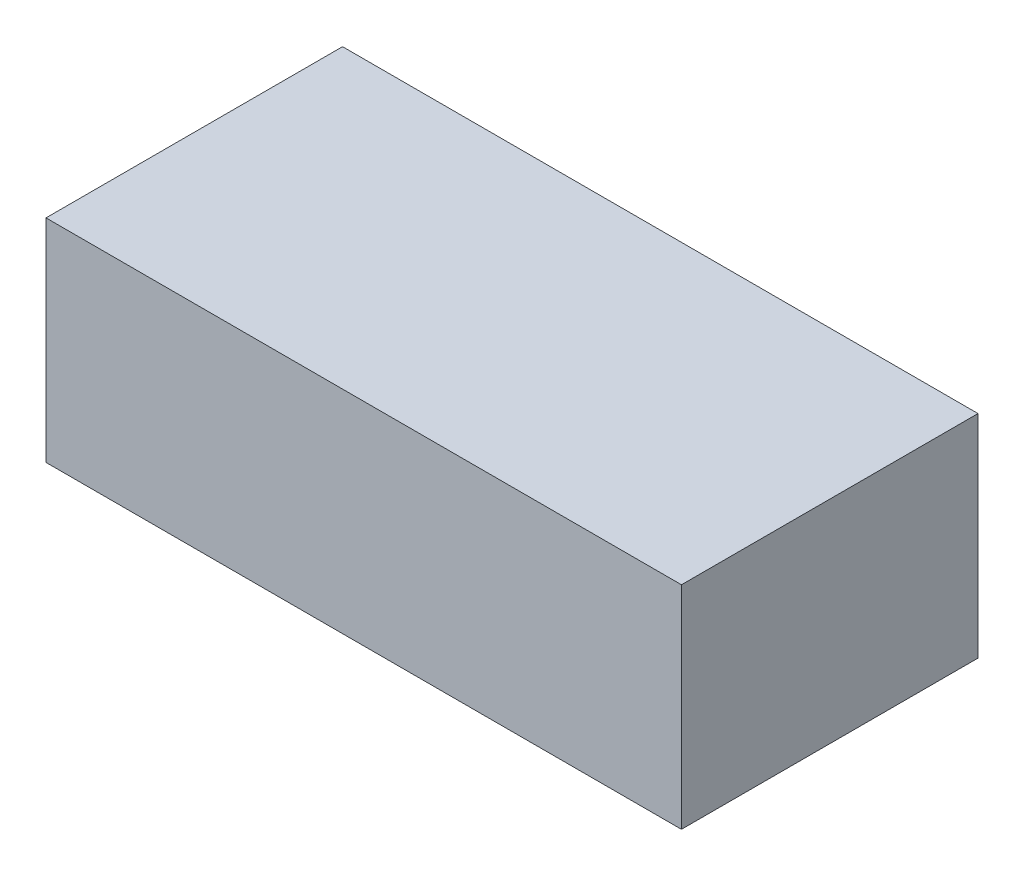
ISO-10303-21;
HEADER;
FILE_DESCRIPTION(('STEP AP214'),'2;1');
FILE_NAME('part.step','',(''),(''),'','','');
FILE_SCHEMA(('AUTOMOTIVE_DESIGN { 1 0 10303 214 1 1 1 1 }'));
ENDSEC;
DATA;
#1=APPLICATION_CONTEXT('core data for automotive mechanical design processes');
#2=APPLICATION_PROTOCOL_DEFINITION('international standard','automotive_design',2000,#1);
#3=PRODUCT_CONTEXT('',#1,'mechanical');
#4=PRODUCT('Part','Part','',(#3));
#5=PRODUCT_RELATED_PRODUCT_CATEGORY('part','',(#4));
#6=PRODUCT_DEFINITION_FORMATION('','',#4);
#7=PRODUCT_DEFINITION_CONTEXT('part definition',#1,'design');
#8=PRODUCT_DEFINITION('design','',#6,#7);
#9=PRODUCT_DEFINITION_SHAPE('','',#8);
#10=(LENGTH_UNIT() NAMED_UNIT(*) SI_UNIT(.MILLI.,.METRE.));
#11=(NAMED_UNIT(*) PLANE_ANGLE_UNIT() SI_UNIT($,.RADIAN.));
#12=(NAMED_UNIT(*) SI_UNIT($,.STERADIAN.) SOLID_ANGLE_UNIT());
#13=UNCERTAINTY_MEASURE_WITH_UNIT(LENGTH_MEASURE(1.E-05),#10,'distance_accuracy_value','');
#14=(GEOMETRIC_REPRESENTATION_CONTEXT(3) GLOBAL_UNCERTAINTY_ASSIGNED_CONTEXT((#13)) GLOBAL_UNIT_ASSIGNED_CONTEXT((#10,
#11,#12)) REPRESENTATION_CONTEXT('',''));
#15=CARTESIAN_POINT('',(0.,0.,0.));
#16=DIRECTION('',(0.,0.,1.));
#17=DIRECTION('',(1.,0.,0.));
#18=AXIS2_PLACEMENT_3D('',#15,#16,#17);
#19=CARTESIAN_POINT('',(0.,0.,35.));
#20=DIRECTION('',(1.,0.,0.));
#21=DIRECTION('',(0.,0.,-1.));
#22=AXIS2_PLACEMENT_3D('',#19,#20,#21);
#23=PLANE('',#22);
#24=DIRECTION('',(0.,-1.,0.));
#25=VECTOR('',#24,1.);
#26=CARTESIAN_POINT('',(0.,0.,0.));
#27=LINE('',#26,#25);
#28=CARTESIAN_POINT('',(0.,25.,0.));
#29=VERTEX_POINT('',#28);
#30=CARTESIAN_POINT('',(0.,0.,0.));
#31=VERTEX_POINT('',#30);
#32=EDGE_CURVE('E102',#29,#31,#27,.T.);
#33=ORIENTED_EDGE('',*,*,#32,.T.);
#34=DIRECTION('',(0.,0.,-1.));
#35=VECTOR('',#34,1.);
#36=CARTESIAN_POINT('',(0.,0.,35.));
#37=LINE('',#36,#35);
#38=CARTESIAN_POINT('',(0.,0.,35.));
#39=VERTEX_POINT('',#38);
#40=EDGE_CURVE('E11',#39,#31,#37,.T.);
#41=ORIENTED_EDGE('',*,*,#40,.F.);
#42=DIRECTION('',(0.,-1.,0.));
#43=VECTOR('',#42,1.);
#44=CARTESIAN_POINT('',(0.,0.,35.));
#45=LINE('',#44,#43);
#46=CARTESIAN_POINT('',(0.,25.,35.));
#47=VERTEX_POINT('',#46);
#48=EDGE_CURVE('E90',#47,#39,#45,.T.);
#49=ORIENTED_EDGE('',*,*,#48,.F.);
#50=DIRECTION('',(0.,0.,-1.));
#51=VECTOR('',#50,1.);
#52=CARTESIAN_POINT('',(0.,25.,35.));
#53=LINE('',#52,#51);
#54=EDGE_CURVE('E98',#47,#29,#53,.T.);
#55=ORIENTED_EDGE('',*,*,#54,.T.);
#56=EDGE_LOOP('',(#33,#41,#49,#55));
#57=FACE_BOUND('',#56,.T.);
#58=ADVANCED_FACE('F39',(#57),#23,.F.);
#59=CARTESIAN_POINT('',(0.,0.,35.));
#60=DIRECTION('',(0.,1.,0.));
#61=DIRECTION('',(0.,0.,1.));
#62=AXIS2_PLACEMENT_3D('',#59,#60,#61);
#63=PLANE('',#62);
#64=DIRECTION('',(1.,0.,0.));
#65=VECTOR('',#64,1.);
#66=CARTESIAN_POINT('',(0.,0.,0.));
#67=LINE('',#66,#65);
#68=CARTESIAN_POINT('',(75.,0.,0.));
#69=VERTEX_POINT('',#68);
#70=EDGE_CURVE('E94',#31,#69,#67,.T.);
#71=ORIENTED_EDGE('',*,*,#70,.T.);
#72=DIRECTION('',(0.,0.,-1.));
#73=VECTOR('',#72,1.);
#74=CARTESIAN_POINT('',(75.,0.,35.));
#75=LINE('',#74,#73);
#76=CARTESIAN_POINT('',(75.,0.,35.));
#77=VERTEX_POINT('',#76);
#78=EDGE_CURVE('E47',#77,#69,#75,.T.);
#79=ORIENTED_EDGE('',*,*,#78,.F.);
#80=DIRECTION('',(1.,0.,0.));
#81=VECTOR('',#80,1.);
#82=CARTESIAN_POINT('',(0.,0.,35.));
#83=LINE('',#82,#81);
#84=EDGE_CURVE('E85',#39,#77,#83,.T.);
#85=ORIENTED_EDGE('',*,*,#84,.F.);
#86=ORIENTED_EDGE('',*,*,#40,.T.);
#87=EDGE_LOOP('',(#71,#79,#85,#86));
#88=FACE_BOUND('',#87,.T.);
#89=ADVANCED_FACE('F93',(#88),#63,.F.);
#90=CARTESIAN_POINT('',(75.,0.,35.));
#91=DIRECTION('',(-1.,0.,0.));
#92=DIRECTION('',(0.,0.,1.));
#93=AXIS2_PLACEMENT_3D('',#90,#91,#92);
#94=PLANE('',#93);
#95=DIRECTION('',(0.,1.,0.));
#96=VECTOR('',#95,1.);
#97=CARTESIAN_POINT('',(75.,0.,0.));
#98=LINE('',#97,#96);
#99=CARTESIAN_POINT('',(75.,25.,0.));
#100=VERTEX_POINT('',#99);
#101=EDGE_CURVE('E72',#69,#100,#98,.T.);
#102=ORIENTED_EDGE('',*,*,#101,.T.);
#103=DIRECTION('',(0.,0.,-1.));
#104=VECTOR('',#103,1.);
#105=CARTESIAN_POINT('',(75.,25.,35.));
#106=LINE('',#105,#104);
#107=CARTESIAN_POINT('',(75.,25.,35.));
#108=VERTEX_POINT('',#107);
#109=EDGE_CURVE('E95',#108,#100,#106,.T.);
#110=ORIENTED_EDGE('',*,*,#109,.F.);
#111=DIRECTION('',(0.,1.,0.));
#112=VECTOR('',#111,1.);
#113=CARTESIAN_POINT('',(75.,0.,35.));
#114=LINE('',#113,#112);
#115=EDGE_CURVE('E88',#77,#108,#114,.T.);
#116=ORIENTED_EDGE('',*,*,#115,.F.);
#117=ORIENTED_EDGE('',*,*,#78,.T.);
#118=EDGE_LOOP('',(#102,#110,#116,#117));
#119=FACE_BOUND('',#118,.T.);
#120=ADVANCED_FACE('F96',(#119),#94,.F.);
#121=CARTESIAN_POINT('',(0.,25.,35.));
#122=DIRECTION('',(0.,-1.,0.));
#123=DIRECTION('',(0.,0.,-1.));
#124=AXIS2_PLACEMENT_3D('',#121,#122,#123);
#125=PLANE('',#124);
#126=DIRECTION('',(-1.,0.,0.));
#127=VECTOR('',#126,1.);
#128=CARTESIAN_POINT('',(0.,25.,0.));
#129=LINE('',#128,#127);
#130=EDGE_CURVE('E78',#100,#29,#129,.T.);
#131=ORIENTED_EDGE('',*,*,#130,.T.);
#132=ORIENTED_EDGE('',*,*,#54,.F.);
#133=DIRECTION('',(-1.,0.,0.));
#134=VECTOR('',#133,1.);
#135=CARTESIAN_POINT('',(0.,25.,35.));
#136=LINE('',#135,#134);
#137=EDGE_CURVE('E55',#108,#47,#136,.T.);
#138=ORIENTED_EDGE('',*,*,#137,.F.);
#139=ORIENTED_EDGE('',*,*,#109,.T.);
#140=EDGE_LOOP('',(#131,#132,#138,#139));
#141=FACE_BOUND('',#140,.T.);
#142=ADVANCED_FACE('F109',(#141),#125,.F.);
#143=CARTESIAN_POINT('',(0.,0.,35.));
#144=DIRECTION('',(0.,0.,-1.));
#145=DIRECTION('',(-1.,0.,0.));
#146=AXIS2_PLACEMENT_3D('',#143,#144,#145);
#147=PLANE('',#146);
#148=ORIENTED_EDGE('',*,*,#48,.T.);
#149=ORIENTED_EDGE('',*,*,#84,.T.);
#150=ORIENTED_EDGE('',*,*,#115,.T.);
#151=ORIENTED_EDGE('',*,*,#137,.T.);
#152=EDGE_LOOP('',(#148,#149,#150,#151));
#153=FACE_BOUND('',#152,.T.);
#154=ADVANCED_FACE('F86',(#153),#147,.F.);
#155=CARTESIAN_POINT('',(0.,0.,0.));
#156=DIRECTION('',(0.,0.,-1.));
#157=DIRECTION('',(-1.,0.,0.));
#158=AXIS2_PLACEMENT_3D('',#155,#156,#157);
#159=PLANE('',#158);
#160=ORIENTED_EDGE('',*,*,#32,.F.);
#161=ORIENTED_EDGE('',*,*,#130,.F.);
#162=ORIENTED_EDGE('',*,*,#101,.F.);
#163=ORIENTED_EDGE('',*,*,#70,.F.);
#164=EDGE_LOOP('',(#160,#161,#162,#163));
#165=FACE_BOUND('',#164,.T.);
#166=ADVANCED_FACE('F112',(#165),#159,.T.);
#167=CLOSED_SHELL('',(#58,#89,#120,#142,#154,#166));
#168=MANIFOLD_SOLID_BREP('B2',#167);
#169=ADVANCED_BREP_SHAPE_REPRESENTATION('',(#18,#168),#14);
#170=SHAPE_DEFINITION_REPRESENTATION(#9,#169);
ENDSEC;
END-ISO-10303-21;
